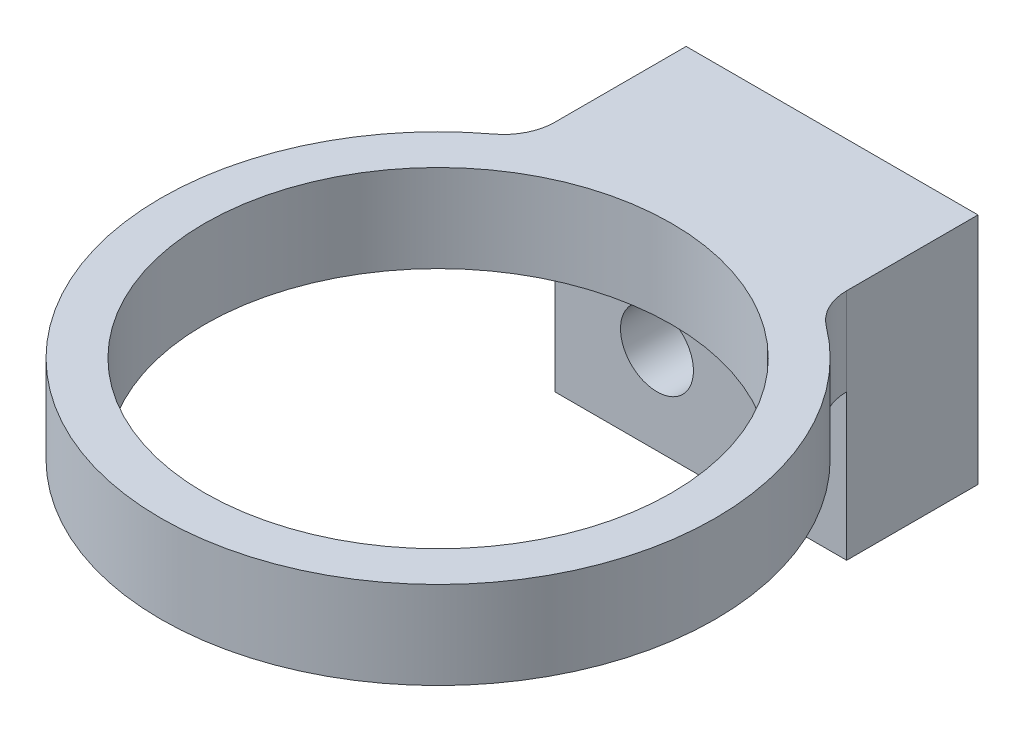
ISO-10303-21;
HEADER;
FILE_DESCRIPTION(('STEP AP214'),'2;1');
FILE_NAME('part.step','',(''),(''),'','','');
FILE_SCHEMA(('AUTOMOTIVE_DESIGN { 1 0 10303 214 1 1 1 1 }'));
ENDSEC;
DATA;
#1=APPLICATION_CONTEXT('core data for automotive mechanical design processes');
#2=APPLICATION_PROTOCOL_DEFINITION('international standard','automotive_design',2000,#1);
#3=PRODUCT_CONTEXT('',#1,'mechanical');
#4=PRODUCT('Part','Part','',(#3));
#5=PRODUCT_RELATED_PRODUCT_CATEGORY('part','',(#4));
#6=PRODUCT_DEFINITION_FORMATION('','',#4);
#7=PRODUCT_DEFINITION_CONTEXT('part definition',#1,'design');
#8=PRODUCT_DEFINITION('design','',#6,#7);
#9=PRODUCT_DEFINITION_SHAPE('','',#8);
#10=(LENGTH_UNIT() NAMED_UNIT(*) SI_UNIT(.MILLI.,.METRE.));
#11=(NAMED_UNIT(*) PLANE_ANGLE_UNIT() SI_UNIT($,.RADIAN.));
#12=(NAMED_UNIT(*) SI_UNIT($,.STERADIAN.) SOLID_ANGLE_UNIT());
#13=UNCERTAINTY_MEASURE_WITH_UNIT(LENGTH_MEASURE(1.E-05),#10,'distance_accuracy_value','');
#14=(GEOMETRIC_REPRESENTATION_CONTEXT(3) GLOBAL_UNCERTAINTY_ASSIGNED_CONTEXT((#13)) GLOBAL_UNIT_ASSIGNED_CONTEXT((#10,
#11,#12)) REPRESENTATION_CONTEXT('',''));
#15=CARTESIAN_POINT('',(0.,0.,0.));
#16=DIRECTION('',(0.,0.,1.));
#17=DIRECTION('',(1.,0.,0.));
#18=AXIS2_PLACEMENT_3D('',#15,#16,#17);
#19=CARTESIAN_POINT('',(0.,3.,13.5));
#20=DIRECTION('',(0.,-1.,0.));
#21=DIRECTION('',(0.,0.,-1.));
#22=AXIS2_PLACEMENT_3D('',#19,#20,#21);
#23=CYLINDRICAL_SURFACE('',#22,9.5);
#24=CARTESIAN_POINT('',(0.,3.,13.5));
#25=DIRECTION('',(0.,-1.,0.));
#26=DIRECTION('',(0.,0.,-1.));
#27=AXIS2_PLACEMENT_3D('',#24,#25,#26);
#28=CIRCLE('',#27,9.5);
#29=CARTESIAN_POINT('',(5.69999997703111,3.,5.89999998277333));
#30=VERTEX_POINT('',#29);
#31=CARTESIAN_POINT('',(-5.69999997703111,3.,5.89999998277333));
#32=VERTEX_POINT('',#31);
#33=EDGE_CURVE('E131',#30,#32,#28,.T.);
#34=ORIENTED_EDGE('',*,*,#33,.T.);
#35=DIRECTION('',(0.,-1.,0.));
#36=VECTOR('',#35,1.);
#37=CARTESIAN_POINT('',(-5.69999997703111,3.,5.89999998277333));
#38=LINE('',#37,#36);
#39=CARTESIAN_POINT('',(-5.69999997703111,0.,5.89999998277333));
#40=VERTEX_POINT('',#39);
#41=EDGE_CURVE('E148',#32,#40,#38,.T.);
#42=ORIENTED_EDGE('',*,*,#41,.T.);
#43=CARTESIAN_POINT('',(0.,0.,13.5));
#44=DIRECTION('',(0.,-1.,0.));
#45=DIRECTION('',(0.,0.,-1.));
#46=AXIS2_PLACEMENT_3D('',#43,#44,#45);
#47=CIRCLE('',#46,9.5);
#48=CARTESIAN_POINT('',(5.69999997703111,0.,5.89999998277333));
#49=VERTEX_POINT('',#48);
#50=EDGE_CURVE('E143',#49,#40,#47,.T.);
#51=ORIENTED_EDGE('',*,*,#50,.F.);
#52=DIRECTION('',(0.,-1.,0.));
#53=VECTOR('',#52,1.);
#54=CARTESIAN_POINT('',(5.69999997703111,3.,5.89999998277333));
#55=LINE('',#54,#53);
#56=EDGE_CURVE('E146',#49,#30,#55,.F.);
#57=ORIENTED_EDGE('',*,*,#56,.T.);
#58=EDGE_LOOP('',(#34,#42,#51,#57));
#59=FACE_BOUND('',#58,.T.);
#60=ADVANCED_FACE('F37',(#59),#23,.T.);
#61=CARTESIAN_POINT('',(5.,3.,0.));
#62=DIRECTION('',(1.,0.,0.));
#63=DIRECTION('',(0.,0.,-1.));
#64=AXIS2_PLACEMENT_3D('',#61,#62,#63);
#65=PLANE('',#64);
#66=DIRECTION('',(0.,0.,1.));
#67=VECTOR('',#66,1.);
#68=CARTESIAN_POINT('',(5.,3.,0.));
#69=LINE('',#68,#67);
#70=CARTESIAN_POINT('',(5.,3.,0.));
#71=VERTEX_POINT('',#70);
#72=CARTESIAN_POINT('',(5.,3.,4.500000034));
#73=VERTEX_POINT('',#72);
#74=EDGE_CURVE('E184',#71,#73,#69,.T.);
#75=ORIENTED_EDGE('',*,*,#74,.T.);
#76=DIRECTION('',(0.,1.,0.));
#77=VECTOR('',#76,1.);
#78=CARTESIAN_POINT('',(5.,0.,4.500000034));
#79=LINE('',#78,#77);
#80=CARTESIAN_POINT('',(5.,0.,4.5));
#81=VERTEX_POINT('',#80);
#82=EDGE_CURVE('E153',#73,#81,#79,.F.);
#83=ORIENTED_EDGE('',*,*,#82,.T.);
#84=DIRECTION('',(0.,1.,0.));
#85=VECTOR('',#84,1.);
#86=CARTESIAN_POINT('',(5.,-5.,4.5));
#87=LINE('',#86,#85);
#88=CARTESIAN_POINT('',(5.,-5.,4.5));
#89=VERTEX_POINT('',#88);
#90=EDGE_CURVE('E138',#89,#81,#87,.T.);
#91=ORIENTED_EDGE('',*,*,#90,.F.);
#92=DIRECTION('',(0.,0.,1.));
#93=VECTOR('',#92,1.);
#94=CARTESIAN_POINT('',(5.,-5.,4.5));
#95=LINE('',#94,#93);
#96=CARTESIAN_POINT('',(5.,-5.,0.));
#97=VERTEX_POINT('',#96);
#98=EDGE_CURVE('E121',#97,#89,#95,.T.);
#99=ORIENTED_EDGE('',*,*,#98,.F.);
#100=DIRECTION('',(0.,-1.,0.));
#101=VECTOR('',#100,1.);
#102=CARTESIAN_POINT('',(5.,3.,0.));
#103=LINE('',#102,#101);
#104=EDGE_CURVE('E149',#71,#97,#103,.T.);
#105=ORIENTED_EDGE('',*,*,#104,.F.);
#106=EDGE_LOOP('',(#75,#83,#91,#99,#105));
#107=FACE_BOUND('',#106,.T.);
#108=ADVANCED_FACE('F181',(#107),#65,.T.);
#109=CARTESIAN_POINT('',(-5.,3.,0.));
#110=DIRECTION('',(0.,0.,-1.));
#111=DIRECTION('',(-1.,0.,0.));
#112=AXIS2_PLACEMENT_3D('',#109,#110,#111);
#113=PLANE('',#112);
#114=CARTESIAN_POINT('',(-1.5,-2.,0.));
#115=DIRECTION('',(0.,0.,1.));
#116=DIRECTION('',(1.,0.,0.));
#117=AXIS2_PLACEMENT_3D('',#114,#115,#116);
#118=CIRCLE('',#117,1.25);
#119=CARTESIAN_POINT('',(-0.250000000000001,-2.,0.));
#120=VERTEX_POINT('',#119);
#121=EDGE_CURVE('E115',#120,#120,#118,.T.);
#122=ORIENTED_EDGE('',*,*,#121,.T.);
#123=EDGE_LOOP('',(#122));
#124=FACE_BOUND('',#123,.T.);
#125=CARTESIAN_POINT('',(3.,1.,0.));
#126=DIRECTION('',(0.,0.,-1.));
#127=DIRECTION('',(-1.,0.,0.));
#128=AXIS2_PLACEMENT_3D('',#125,#126,#127);
#129=CIRCLE('',#128,0.799999999999999);
#130=CARTESIAN_POINT('',(2.2,1.,0.));
#131=VERTEX_POINT('',#130);
#132=EDGE_CURVE('E109',#131,#131,#129,.T.);
#133=ORIENTED_EDGE('',*,*,#132,.F.);
#134=EDGE_LOOP('',(#133));
#135=FACE_BOUND('',#134,.T.);
#136=ORIENTED_EDGE('',*,*,#104,.T.);
#137=DIRECTION('',(1.,0.,0.));
#138=VECTOR('',#137,1.);
#139=CARTESIAN_POINT('',(5.,-5.,0.));
#140=LINE('',#139,#138);
#141=CARTESIAN_POINT('',(-5.,-5.,0.));
#142=VERTEX_POINT('',#141);
#143=EDGE_CURVE('E112',#142,#97,#140,.T.);
#144=ORIENTED_EDGE('',*,*,#143,.F.);
#145=DIRECTION('',(0.,-1.,0.));
#146=VECTOR('',#145,1.);
#147=CARTESIAN_POINT('',(-5.,3.,0.));
#148=LINE('',#147,#146);
#149=CARTESIAN_POINT('',(-5.,3.,0.));
#150=VERTEX_POINT('',#149);
#151=EDGE_CURVE('E135',#150,#142,#148,.T.);
#152=ORIENTED_EDGE('',*,*,#151,.F.);
#153=DIRECTION('',(1.,0.,0.));
#154=VECTOR('',#153,1.);
#155=CARTESIAN_POINT('',(-5.,3.,0.));
#156=LINE('',#155,#154);
#157=EDGE_CURVE('E187',#150,#71,#156,.T.);
#158=ORIENTED_EDGE('',*,*,#157,.T.);
#159=EDGE_LOOP('',(#136,#144,#152,#158));
#160=FACE_BOUND('',#159,.T.);
#161=ADVANCED_FACE('F193',(#124,#135,#160),#113,.T.);
#162=CARTESIAN_POINT('',(-5.,3.,5.42225278929824));
#163=DIRECTION('',(-1.,0.,0.));
#164=DIRECTION('',(0.,0.,1.));
#165=AXIS2_PLACEMENT_3D('',#162,#163,#164);
#166=PLANE('',#165);
#167=DIRECTION('',(0.,1.,0.));
#168=VECTOR('',#167,1.);
#169=CARTESIAN_POINT('',(-5.,-5.,4.5));
#170=LINE('',#169,#168);
#171=CARTESIAN_POINT('',(-5.,-5.,4.5));
#172=VERTEX_POINT('',#171);
#173=CARTESIAN_POINT('',(-5.,0.,4.5));
#174=VERTEX_POINT('',#173);
#175=EDGE_CURVE('E128',#172,#174,#170,.T.);
#176=ORIENTED_EDGE('',*,*,#175,.T.);
#177=DIRECTION('',(0.,1.,0.));
#178=VECTOR('',#177,1.);
#179=CARTESIAN_POINT('',(-5.,3.,4.500000034));
#180=LINE('',#179,#178);
#181=CARTESIAN_POINT('',(-5.,3.,4.500000034));
#182=VERTEX_POINT('',#181);
#183=EDGE_CURVE('E58',#174,#182,#180,.T.);
#184=ORIENTED_EDGE('',*,*,#183,.T.);
#185=DIRECTION('',(0.,0.,-1.));
#186=VECTOR('',#185,1.);
#187=CARTESIAN_POINT('',(-5.,3.,5.42225278929824));
#188=LINE('',#187,#186);
#189=EDGE_CURVE('E189',#182,#150,#188,.T.);
#190=ORIENTED_EDGE('',*,*,#189,.T.);
#191=ORIENTED_EDGE('',*,*,#151,.T.);
#192=DIRECTION('',(0.,0.,-1.));
#193=VECTOR('',#192,1.);
#194=CARTESIAN_POINT('',(-5.,-5.,0.));
#195=LINE('',#194,#193);
#196=EDGE_CURVE('E125',#172,#142,#195,.T.);
#197=ORIENTED_EDGE('',*,*,#196,.F.);
#198=EDGE_LOOP('',(#176,#184,#190,#191,#197));
#199=FACE_BOUND('',#198,.T.);
#200=ADVANCED_FACE('F198',(#199),#166,.T.);
#201=CARTESIAN_POINT('',(0.,3.,13.5));
#202=DIRECTION('',(0.,-1.,0.));
#203=DIRECTION('',(0.,0.,-1.));
#204=AXIS2_PLACEMENT_3D('',#201,#202,#203);
#205=PLANE('',#204);
#206=CARTESIAN_POINT('',(0.,3.,13.5));
#207=DIRECTION('',(0.,-1.,0.));
#208=DIRECTION('',(0.,0.,-1.));
#209=AXIS2_PLACEMENT_3D('',#206,#207,#208);
#210=CIRCLE('',#209,8.);
#211=CARTESIAN_POINT('',(0.,3.,5.5));
#212=VERTEX_POINT('',#211);
#213=EDGE_CURVE('E259',#212,#212,#210,.T.);
#214=ORIENTED_EDGE('',*,*,#213,.T.);
#215=EDGE_LOOP('',(#214));
#216=FACE_BOUND('',#215,.T.);
#217=ORIENTED_EDGE('',*,*,#33,.F.);
#218=CARTESIAN_POINT('',(6.749999932,3.,4.500000034));
#219=DIRECTION('',(0.,-1.,0.));
#220=DIRECTION('',(0.,0.,-1.));
#221=AXIS2_PLACEMENT_3D('',#218,#219,#220);
#222=CIRCLE('',#221,1.749999932);
#223=EDGE_CURVE('E11',#30,#73,#222,.T.);
#224=ORIENTED_EDGE('',*,*,#223,.T.);
#225=ORIENTED_EDGE('',*,*,#74,.F.);
#226=ORIENTED_EDGE('',*,*,#157,.F.);
#227=ORIENTED_EDGE('',*,*,#189,.F.);
#228=CARTESIAN_POINT('',(-6.749999932,3.,4.500000034));
#229=DIRECTION('',(0.,-1.,0.));
#230=DIRECTION('',(0.,0.,-1.));
#231=AXIS2_PLACEMENT_3D('',#228,#229,#230);
#232=CIRCLE('',#231,1.749999932);
#233=EDGE_CURVE('E162',#182,#32,#232,.T.);
#234=ORIENTED_EDGE('',*,*,#233,.T.);
#235=EDGE_LOOP('',(#217,#224,#225,#226,#227,#234));
#236=FACE_BOUND('',#235,.T.);
#237=ADVANCED_FACE('F199',(#216,#236),#205,.F.);
#238=CARTESIAN_POINT('',(0.,0.,13.5));
#239=DIRECTION('',(0.,-1.,0.));
#240=DIRECTION('',(0.,0.,-1.));
#241=AXIS2_PLACEMENT_3D('',#238,#239,#240);
#242=PLANE('',#241);
#243=CARTESIAN_POINT('',(0.,0.,13.5));
#244=DIRECTION('',(0.,-1.,0.));
#245=DIRECTION('',(0.,0.,-1.));
#246=AXIS2_PLACEMENT_3D('',#243,#244,#245);
#247=CIRCLE('',#246,8.);
#248=CARTESIAN_POINT('',(0.,0.,5.5));
#249=VERTEX_POINT('',#248);
#250=EDGE_CURVE('E261',#249,#249,#247,.T.);
#251=ORIENTED_EDGE('',*,*,#250,.F.);
#252=EDGE_LOOP('',(#251));
#253=FACE_BOUND('',#252,.T.);
#254=DIRECTION('',(-1.,0.,0.));
#255=VECTOR('',#254,1.);
#256=CARTESIAN_POINT('',(-5.,0.,4.5));
#257=LINE('',#256,#255);
#258=EDGE_CURVE('E108',#81,#174,#257,.T.);
#259=ORIENTED_EDGE('',*,*,#258,.F.);
#260=CARTESIAN_POINT('',(6.749999932,0.,4.500000034));
#261=DIRECTION('',(0.,-1.,0.));
#262=DIRECTION('',(0.,0.,-1.));
#263=AXIS2_PLACEMENT_3D('',#260,#261,#262);
#264=CIRCLE('',#263,1.749999932);
#265=EDGE_CURVE('E45',#81,#49,#264,.F.);
#266=ORIENTED_EDGE('',*,*,#265,.T.);
#267=ORIENTED_EDGE('',*,*,#50,.T.);
#268=CARTESIAN_POINT('',(-6.749999932,0.,4.500000034));
#269=DIRECTION('',(0.,-1.,0.));
#270=DIRECTION('',(0.,0.,-1.));
#271=AXIS2_PLACEMENT_3D('',#268,#269,#270);
#272=CIRCLE('',#271,1.749999932);
#273=EDGE_CURVE('E158',#40,#174,#272,.F.);
#274=ORIENTED_EDGE('',*,*,#273,.T.);
#275=EDGE_LOOP('',(#259,#266,#267,#274));
#276=FACE_BOUND('',#275,.T.);
#277=ADVANCED_FACE('F171',(#253,#276),#242,.T.);
#278=CARTESIAN_POINT('',(-5.,-5.,4.5));
#279=DIRECTION('',(0.,0.,-1.));
#280=DIRECTION('',(-1.,0.,0.));
#281=AXIS2_PLACEMENT_3D('',#278,#279,#280);
#282=PLANE('',#281);
#283=CARTESIAN_POINT('',(-1.5,-2.,4.5));
#284=DIRECTION('',(0.,0.,1.));
#285=DIRECTION('',(1.,0.,0.));
#286=AXIS2_PLACEMENT_3D('',#283,#284,#285);
#287=CIRCLE('',#286,1.25);
#288=CARTESIAN_POINT('',(-0.250000000000001,-2.,4.5));
#289=VERTEX_POINT('',#288);
#290=EDGE_CURVE('E260',#289,#289,#287,.T.);
#291=ORIENTED_EDGE('',*,*,#290,.F.);
#292=EDGE_LOOP('',(#291));
#293=FACE_BOUND('',#292,.T.);
#294=ORIENTED_EDGE('',*,*,#258,.T.);
#295=ORIENTED_EDGE('',*,*,#175,.F.);
#296=DIRECTION('',(-1.,0.,0.));
#297=VECTOR('',#296,1.);
#298=CARTESIAN_POINT('',(-5.,-5.,4.5));
#299=LINE('',#298,#297);
#300=EDGE_CURVE('E123',#89,#172,#299,.T.);
#301=ORIENTED_EDGE('',*,*,#300,.F.);
#302=ORIENTED_EDGE('',*,*,#90,.T.);
#303=EDGE_LOOP('',(#294,#295,#301,#302));
#304=FACE_BOUND('',#303,.T.);
#305=ADVANCED_FACE('F204',(#293,#304),#282,.F.);
#306=CARTESIAN_POINT('',(0.,-5.,0.));
#307=DIRECTION('',(0.,1.,0.));
#308=DIRECTION('',(0.,0.,1.));
#309=AXIS2_PLACEMENT_3D('',#306,#307,#308);
#310=PLANE('',#309);
#311=ORIENTED_EDGE('',*,*,#143,.T.);
#312=ORIENTED_EDGE('',*,*,#98,.T.);
#313=ORIENTED_EDGE('',*,*,#300,.T.);
#314=ORIENTED_EDGE('',*,*,#196,.T.);
#315=EDGE_LOOP('',(#311,#312,#313,#314));
#316=FACE_BOUND('',#315,.T.);
#317=ADVANCED_FACE('F102',(#316),#310,.F.);
#318=CARTESIAN_POINT('',(3.,1.,5.2));
#319=DIRECTION('',(0.,0.,-1.));
#320=DIRECTION('',(-1.,0.,0.));
#321=AXIS2_PLACEMENT_3D('',#318,#319,#320);
#322=CONICAL_SURFACE('',#321,0.799999999999999,1.02974425867665);
#323=CARTESIAN_POINT('',(3.,1.,5.68068849522205));
#324=VERTEX_POINT('',#323);
#325=VERTEX_LOOP('',#324);
#326=FACE_BOUND('',#325,.T.);
#327=CARTESIAN_POINT('',(3.,1.,5.2));
#328=DIRECTION('',(0.,0.,-1.));
#329=DIRECTION('',(-1.,0.,0.));
#330=AXIS2_PLACEMENT_3D('',#327,#328,#329);
#331=CIRCLE('',#330,0.799999999999999);
#332=CARTESIAN_POINT('',(2.2,1.,5.2));
#333=VERTEX_POINT('',#332);
#334=EDGE_CURVE('E106',#333,#333,#331,.T.);
#335=ORIENTED_EDGE('',*,*,#334,.T.);
#336=EDGE_LOOP('',(#335));
#337=FACE_BOUND('',#336,.T.);
#338=ADVANCED_FACE('F98',(#326,#337),#322,.F.);
#339=CARTESIAN_POINT('',(3.,1.,0.));
#340=DIRECTION('',(0.,0.,-1.));
#341=DIRECTION('',(-1.,0.,0.));
#342=AXIS2_PLACEMENT_3D('',#339,#340,#341);
#343=CYLINDRICAL_SURFACE('',#342,0.799999999999999);
#344=ORIENTED_EDGE('',*,*,#334,.F.);
#345=EDGE_LOOP('',(#344));
#346=FACE_BOUND('',#345,.T.);
#347=ORIENTED_EDGE('',*,*,#132,.T.);
#348=EDGE_LOOP('',(#347));
#349=FACE_BOUND('',#348,.T.);
#350=ADVANCED_FACE('F101',(#346,#349),#343,.F.);
#351=CARTESIAN_POINT('',(-1.5,-2.,4.5));
#352=DIRECTION('',(0.,0.,1.));
#353=DIRECTION('',(1.,0.,0.));
#354=AXIS2_PLACEMENT_3D('',#351,#352,#353);
#355=CYLINDRICAL_SURFACE('',#354,1.25);
#356=ORIENTED_EDGE('',*,*,#121,.F.);
#357=EDGE_LOOP('',(#356));
#358=FACE_BOUND('',#357,.T.);
#359=ORIENTED_EDGE('',*,*,#290,.T.);
#360=EDGE_LOOP('',(#359));
#361=FACE_BOUND('',#360,.T.);
#362=ADVANCED_FACE('F231',(#358,#361),#355,.F.);
#363=CARTESIAN_POINT('',(0.,0.,13.5));
#364=DIRECTION('',(0.,-1.,0.));
#365=DIRECTION('',(0.,0.,-1.));
#366=AXIS2_PLACEMENT_3D('',#363,#364,#365);
#367=CYLINDRICAL_SURFACE('',#366,8.);
#368=ORIENTED_EDGE('',*,*,#213,.F.);
#369=EDGE_LOOP('',(#368));
#370=FACE_BOUND('',#369,.T.);
#371=ORIENTED_EDGE('',*,*,#250,.T.);
#372=EDGE_LOOP('',(#371));
#373=FACE_BOUND('',#372,.T.);
#374=ADVANCED_FACE('F226',(#370,#373),#367,.F.);
#375=CARTESIAN_POINT('',(-6.749999932,3.,4.500000034));
#376=DIRECTION('',(0.,-1.,0.));
#377=DIRECTION('',(0.,0.,-1.));
#378=AXIS2_PLACEMENT_3D('',#375,#376,#377);
#379=CYLINDRICAL_SURFACE('',#378,1.749999932);
#380=ORIENTED_EDGE('',*,*,#233,.F.);
#381=ORIENTED_EDGE('',*,*,#183,.F.);
#382=ORIENTED_EDGE('',*,*,#273,.F.);
#383=ORIENTED_EDGE('',*,*,#41,.F.);
#384=EDGE_LOOP('',(#380,#381,#382,#383));
#385=FACE_BOUND('',#384,.T.);
#386=ADVANCED_FACE('F202',(#385),#379,.F.);
#387=CARTESIAN_POINT('',(6.749999932,3.,4.500000034));
#388=DIRECTION('',(0.,-1.,0.));
#389=DIRECTION('',(0.,0.,-1.));
#390=AXIS2_PLACEMENT_3D('',#387,#388,#389);
#391=CYLINDRICAL_SURFACE('',#390,1.749999932);
#392=ORIENTED_EDGE('',*,*,#223,.F.);
#393=ORIENTED_EDGE('',*,*,#56,.F.);
#394=ORIENTED_EDGE('',*,*,#265,.F.);
#395=ORIENTED_EDGE('',*,*,#82,.F.);
#396=EDGE_LOOP('',(#392,#393,#394,#395));
#397=FACE_BOUND('',#396,.T.);
#398=ADVANCED_FACE('F39',(#397),#391,.F.);
#399=CLOSED_SHELL('',(#60,#108,#161,#200,#237,#277,#305,#317,#338,#350,#362,#374,#386,#398));
#400=MANIFOLD_SOLID_BREP('B2',#399);
#401=ADVANCED_BREP_SHAPE_REPRESENTATION('',(#18,#400),#14);
#402=SHAPE_DEFINITION_REPRESENTATION(#9,#401);
ENDSEC;
END-ISO-10303-21;
